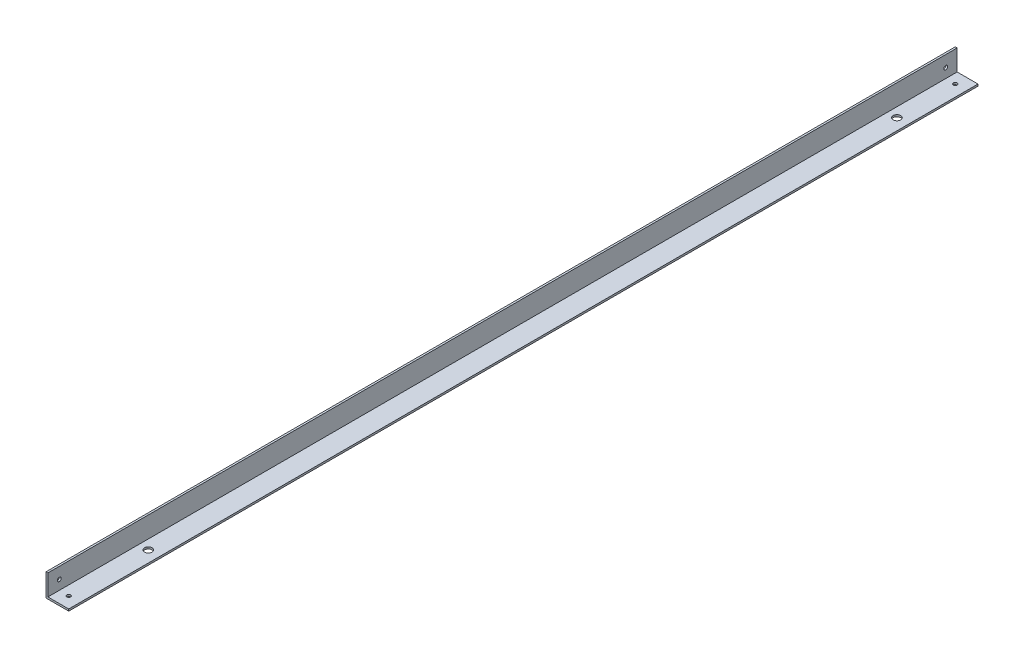
ISO-10303-21;
HEADER;
FILE_DESCRIPTION(('STEP AP214'),'2;1');
FILE_NAME('part.step','',(''),(''),'','','');
FILE_SCHEMA(('AUTOMOTIVE_DESIGN { 1 0 10303 214 1 1 1 1 }'));
ENDSEC;
DATA;
#1=APPLICATION_CONTEXT('core data for automotive mechanical design processes');
#2=APPLICATION_PROTOCOL_DEFINITION('international standard','automotive_design',2000,#1);
#3=PRODUCT_CONTEXT('',#1,'mechanical');
#4=PRODUCT('Part','Part','',(#3));
#5=PRODUCT_RELATED_PRODUCT_CATEGORY('part','',(#4));
#6=PRODUCT_DEFINITION_FORMATION('','',#4);
#7=PRODUCT_DEFINITION_CONTEXT('part definition',#1,'design');
#8=PRODUCT_DEFINITION('design','',#6,#7);
#9=PRODUCT_DEFINITION_SHAPE('','',#8);
#10=(LENGTH_UNIT() NAMED_UNIT(*) SI_UNIT(.MILLI.,.METRE.));
#11=(NAMED_UNIT(*) PLANE_ANGLE_UNIT() SI_UNIT($,.RADIAN.));
#12=(NAMED_UNIT(*) SI_UNIT($,.STERADIAN.) SOLID_ANGLE_UNIT());
#13=UNCERTAINTY_MEASURE_WITH_UNIT(LENGTH_MEASURE(1.E-05),#10,'distance_accuracy_value','');
#14=(GEOMETRIC_REPRESENTATION_CONTEXT(3) GLOBAL_UNCERTAINTY_ASSIGNED_CONTEXT((#13)) GLOBAL_UNIT_ASSIGNED_CONTEXT((#10,
#11,#12)) REPRESENTATION_CONTEXT('',''));
#15=CARTESIAN_POINT('',(0.,0.,0.));
#16=DIRECTION('',(0.,0.,1.));
#17=DIRECTION('',(1.,0.,0.));
#18=AXIS2_PLACEMENT_3D('',#15,#16,#17);
#19=CARTESIAN_POINT('',(0.,0.,-762.));
#20=DIRECTION('',(0.,-1.,0.));
#21=DIRECTION('',(0.,0.,-1.));
#22=AXIS2_PLACEMENT_3D('',#19,#20,#21);
#23=PLANE('',#22);
#24=CARTESIAN_POINT('',(9.525,0.,-752.475));
#25=DIRECTION('',(0.,-1.,0.));
#26=DIRECTION('',(0.,0.,-1.));
#27=AXIS2_PLACEMENT_3D('',#24,#25,#26);
#28=CIRCLE('',#27,1.58750000000003);
#29=CARTESIAN_POINT('',(9.525,0.,-754.0625));
#30=VERTEX_POINT('',#29);
#31=EDGE_CURVE('E149',#30,#30,#28,.T.);
#32=ORIENTED_EDGE('',*,*,#31,.F.);
#33=EDGE_LOOP('',(#32));
#34=FACE_BOUND('',#33,.T.);
#35=CARTESIAN_POINT('',(9.525,0.,-76.2));
#36=DIRECTION('',(0.,-1.,0.));
#37=DIRECTION('',(0.,0.,-1.));
#38=AXIS2_PLACEMENT_3D('',#35,#36,#37);
#39=CIRCLE('',#38,3.175);
#40=CARTESIAN_POINT('',(9.525,0.,-79.375));
#41=VERTEX_POINT('',#40);
#42=EDGE_CURVE('E146',#41,#41,#39,.T.);
#43=ORIENTED_EDGE('',*,*,#42,.F.);
#44=EDGE_LOOP('',(#43));
#45=FACE_BOUND('',#44,.T.);
#46=CARTESIAN_POINT('',(9.525,0.,-703.58));
#47=DIRECTION('',(0.,-1.,0.));
#48=DIRECTION('',(0.,0.,-1.));
#49=AXIS2_PLACEMENT_3D('',#46,#47,#48);
#50=CIRCLE('',#49,3.175);
#51=CARTESIAN_POINT('',(9.525,0.,-706.755));
#52=VERTEX_POINT('',#51);
#53=EDGE_CURVE('E118',#52,#52,#50,.T.);
#54=ORIENTED_EDGE('',*,*,#53,.F.);
#55=EDGE_LOOP('',(#54));
#56=FACE_BOUND('',#55,.T.);
#57=CARTESIAN_POINT('',(9.525,0.,-9.525));
#58=DIRECTION('',(0.,-1.,0.));
#59=DIRECTION('',(0.,0.,-1.));
#60=AXIS2_PLACEMENT_3D('',#57,#58,#59);
#61=CIRCLE('',#60,1.5875);
#62=CARTESIAN_POINT('',(9.525,0.,-11.1125));
#63=VERTEX_POINT('',#62);
#64=EDGE_CURVE('E113',#63,#63,#61,.T.);
#65=ORIENTED_EDGE('',*,*,#64,.F.);
#66=EDGE_LOOP('',(#65));
#67=FACE_BOUND('',#66,.T.);
#68=DIRECTION('',(1.,0.,0.));
#69=VECTOR('',#68,1.);
#70=CARTESIAN_POINT('',(0.,0.,-762.));
#71=LINE('',#70,#69);
#72=CARTESIAN_POINT('',(0.,0.,-762.));
#73=VERTEX_POINT('',#72);
#74=CARTESIAN_POINT('',(19.05,0.,-762.));
#75=VERTEX_POINT('',#74);
#76=EDGE_CURVE('E107',#73,#75,#71,.T.);
#77=ORIENTED_EDGE('',*,*,#76,.T.);
#78=DIRECTION('',(0.,0.,1.));
#79=VECTOR('',#78,1.);
#80=CARTESIAN_POINT('',(19.05,0.,-762.));
#81=LINE('',#80,#79);
#82=CARTESIAN_POINT('',(19.05,0.,0.));
#83=VERTEX_POINT('',#82);
#84=EDGE_CURVE('E98',#75,#83,#81,.T.);
#85=ORIENTED_EDGE('',*,*,#84,.T.);
#86=DIRECTION('',(1.,0.,0.));
#87=VECTOR('',#86,1.);
#88=CARTESIAN_POINT('',(0.,0.,0.));
#89=LINE('',#88,#87);
#90=CARTESIAN_POINT('',(0.,0.,0.));
#91=VERTEX_POINT('',#90);
#92=EDGE_CURVE('E105',#91,#83,#89,.T.);
#93=ORIENTED_EDGE('',*,*,#92,.F.);
#94=DIRECTION('',(0.,0.,1.));
#95=VECTOR('',#94,1.);
#96=CARTESIAN_POINT('',(0.,0.,-762.));
#97=LINE('',#96,#95);
#98=EDGE_CURVE('E12',#73,#91,#97,.T.);
#99=ORIENTED_EDGE('',*,*,#98,.F.);
#100=EDGE_LOOP('',(#77,#85,#93,#99));
#101=FACE_BOUND('',#100,.T.);
#102=ADVANCED_FACE('F37',(#34,#45,#56,#67,#101),#23,.T.);
#103=CARTESIAN_POINT('',(19.05,1.5875,-762.));
#104=DIRECTION('',(0.,1.,0.));
#105=DIRECTION('',(0.,0.,1.));
#106=AXIS2_PLACEMENT_3D('',#103,#104,#105);
#107=PLANE('',#106);
#108=CARTESIAN_POINT('',(9.525,1.5875,-752.475));
#109=DIRECTION('',(0.,1.,0.));
#110=DIRECTION('',(0.,0.,1.));
#111=AXIS2_PLACEMENT_3D('',#108,#109,#110);
#112=CIRCLE('',#111,1.58750000000003);
#113=CARTESIAN_POINT('',(9.525,1.5875,-750.8875));
#114=VERTEX_POINT('',#113);
#115=EDGE_CURVE('E156',#114,#114,#112,.T.);
#116=ORIENTED_EDGE('',*,*,#115,.F.);
#117=EDGE_LOOP('',(#116));
#118=FACE_BOUND('',#117,.T.);
#119=CARTESIAN_POINT('',(9.525,1.5875,-76.2));
#120=DIRECTION('',(0.,1.,0.));
#121=DIRECTION('',(0.,0.,1.));
#122=AXIS2_PLACEMENT_3D('',#119,#120,#121);
#123=CIRCLE('',#122,3.175);
#124=CARTESIAN_POINT('',(9.525,1.5875,-73.025));
#125=VERTEX_POINT('',#124);
#126=EDGE_CURVE('E153',#125,#125,#123,.T.);
#127=ORIENTED_EDGE('',*,*,#126,.F.);
#128=EDGE_LOOP('',(#127));
#129=FACE_BOUND('',#128,.T.);
#130=CARTESIAN_POINT('',(9.525,1.5875,-703.58));
#131=DIRECTION('',(0.,1.,0.));
#132=DIRECTION('',(0.,0.,1.));
#133=AXIS2_PLACEMENT_3D('',#130,#131,#132);
#134=CIRCLE('',#133,3.175);
#135=CARTESIAN_POINT('',(9.525,1.5875,-700.405));
#136=VERTEX_POINT('',#135);
#137=EDGE_CURVE('E157',#136,#136,#134,.T.);
#138=ORIENTED_EDGE('',*,*,#137,.F.);
#139=EDGE_LOOP('',(#138));
#140=FACE_BOUND('',#139,.T.);
#141=CARTESIAN_POINT('',(9.525,1.5875,-9.525));
#142=DIRECTION('',(0.,1.,0.));
#143=DIRECTION('',(0.,0.,1.));
#144=AXIS2_PLACEMENT_3D('',#141,#142,#143);
#145=CIRCLE('',#144,1.5875);
#146=CARTESIAN_POINT('',(9.525,1.5875,-7.9375));
#147=VERTEX_POINT('',#146);
#148=EDGE_CURVE('E152',#147,#147,#145,.T.);
#149=ORIENTED_EDGE('',*,*,#148,.F.);
#150=EDGE_LOOP('',(#149));
#151=FACE_BOUND('',#150,.T.);
#152=DIRECTION('',(-1.,0.,0.));
#153=VECTOR('',#152,1.);
#154=CARTESIAN_POINT('',(19.05,1.5875,0.));
#155=LINE('',#154,#153);
#156=CARTESIAN_POINT('',(19.05,1.5875,0.));
#157=VERTEX_POINT('',#156);
#158=CARTESIAN_POINT('',(1.5875,1.5875,0.));
#159=VERTEX_POINT('',#158);
#160=EDGE_CURVE('E112',#157,#159,#155,.T.);
#161=ORIENTED_EDGE('',*,*,#160,.F.);
#162=DIRECTION('',(0.,0.,-1.));
#163=VECTOR('',#162,1.);
#164=CARTESIAN_POINT('',(19.05,1.5875,-762.));
#165=LINE('',#164,#163);
#166=CARTESIAN_POINT('',(19.05,1.5875,-762.));
#167=VERTEX_POINT('',#166);
#168=EDGE_CURVE('E53',#157,#167,#165,.T.);
#169=ORIENTED_EDGE('',*,*,#168,.T.);
#170=DIRECTION('',(-1.,0.,0.));
#171=VECTOR('',#170,1.);
#172=CARTESIAN_POINT('',(19.05,1.5875,-762.));
#173=LINE('',#172,#171);
#174=CARTESIAN_POINT('',(1.5875,1.5875,-762.));
#175=VERTEX_POINT('',#174);
#176=EDGE_CURVE('E86',#167,#175,#173,.T.);
#177=ORIENTED_EDGE('',*,*,#176,.T.);
#178=DIRECTION('',(0.,0.,1.));
#179=VECTOR('',#178,1.);
#180=CARTESIAN_POINT('',(1.5875,1.5875,-762.));
#181=LINE('',#180,#179);
#182=EDGE_CURVE('E40',#175,#159,#181,.T.);
#183=ORIENTED_EDGE('',*,*,#182,.T.);
#184=EDGE_LOOP('',(#161,#169,#177,#183));
#185=FACE_BOUND('',#184,.T.);
#186=ADVANCED_FACE('F178',(#118,#129,#140,#151,#185),#107,.T.);
#187=CARTESIAN_POINT('',(0.,0.,-762.));
#188=DIRECTION('',(0.,0.,1.));
#189=DIRECTION('',(1.,0.,0.));
#190=AXIS2_PLACEMENT_3D('',#187,#188,#189);
#191=PLANE('',#190);
#192=DIRECTION('',(0.,1.,0.));
#193=VECTOR('',#192,1.);
#194=CARTESIAN_POINT('',(19.05,19.05,-762.));
#195=LINE('',#194,#193);
#196=EDGE_CURVE('E103',#75,#167,#195,.T.);
#197=ORIENTED_EDGE('',*,*,#196,.F.);
#198=ORIENTED_EDGE('',*,*,#76,.F.);
#199=DIRECTION('',(0.,-1.,0.));
#200=VECTOR('',#199,1.);
#201=CARTESIAN_POINT('',(0.,0.,-762.));
#202=LINE('',#201,#200);
#203=CARTESIAN_POINT('',(0.,19.05,-762.));
#204=VERTEX_POINT('',#203);
#205=EDGE_CURVE('E121',#204,#73,#202,.T.);
#206=ORIENTED_EDGE('',*,*,#205,.F.);
#207=DIRECTION('',(-1.,0.,0.));
#208=VECTOR('',#207,1.);
#209=CARTESIAN_POINT('',(0.,19.05,-762.));
#210=LINE('',#209,#208);
#211=CARTESIAN_POINT('',(1.5875,19.05,-762.));
#212=VERTEX_POINT('',#211);
#213=EDGE_CURVE('E134',#212,#204,#210,.T.);
#214=ORIENTED_EDGE('',*,*,#213,.F.);
#215=DIRECTION('',(0.,1.,0.));
#216=VECTOR('',#215,1.);
#217=CARTESIAN_POINT('',(1.5875,1.5875,-762.));
#218=LINE('',#217,#216);
#219=EDGE_CURVE('E137',#175,#212,#218,.T.);
#220=ORIENTED_EDGE('',*,*,#219,.F.);
#221=ORIENTED_EDGE('',*,*,#176,.F.);
#222=EDGE_LOOP('',(#197,#198,#206,#214,#220,#221));
#223=FACE_BOUND('',#222,.T.);
#224=ADVANCED_FACE('F180',(#223),#191,.F.);
#225=CARTESIAN_POINT('',(0.,0.,0.));
#226=DIRECTION('',(0.,0.,1.));
#227=DIRECTION('',(1.,0.,0.));
#228=AXIS2_PLACEMENT_3D('',#225,#226,#227);
#229=PLANE('',#228);
#230=ORIENTED_EDGE('',*,*,#92,.T.);
#231=DIRECTION('',(0.,1.,0.));
#232=VECTOR('',#231,1.);
#233=CARTESIAN_POINT('',(19.05,19.05,0.));
#234=LINE('',#233,#232);
#235=EDGE_CURVE('E95',#83,#157,#234,.T.);
#236=ORIENTED_EDGE('',*,*,#235,.T.);
#237=ORIENTED_EDGE('',*,*,#160,.T.);
#238=DIRECTION('',(0.,1.,0.));
#239=VECTOR('',#238,1.);
#240=CARTESIAN_POINT('',(1.5875,1.5875,0.));
#241=LINE('',#240,#239);
#242=CARTESIAN_POINT('',(1.5875,19.05,0.));
#243=VERTEX_POINT('',#242);
#244=EDGE_CURVE('E115',#159,#243,#241,.T.);
#245=ORIENTED_EDGE('',*,*,#244,.T.);
#246=DIRECTION('',(-1.,0.,0.));
#247=VECTOR('',#246,1.);
#248=CARTESIAN_POINT('',(0.,19.05,0.));
#249=LINE('',#248,#247);
#250=CARTESIAN_POINT('',(0.,19.05,0.));
#251=VERTEX_POINT('',#250);
#252=EDGE_CURVE('E126',#243,#251,#249,.T.);
#253=ORIENTED_EDGE('',*,*,#252,.T.);
#254=DIRECTION('',(0.,-1.,0.));
#255=VECTOR('',#254,1.);
#256=CARTESIAN_POINT('',(0.,0.,0.));
#257=LINE('',#256,#255);
#258=EDGE_CURVE('E111',#251,#91,#257,.T.);
#259=ORIENTED_EDGE('',*,*,#258,.T.);
#260=EDGE_LOOP('',(#230,#236,#237,#245,#253,#259));
#261=FACE_BOUND('',#260,.T.);
#262=ADVANCED_FACE('F109',(#261),#229,.T.);
#263=CARTESIAN_POINT('',(0.,0.,-762.));
#264=DIRECTION('',(-1.,0.,0.));
#265=DIRECTION('',(0.,0.,1.));
#266=AXIS2_PLACEMENT_3D('',#263,#264,#265);
#267=PLANE('',#266);
#268=CARTESIAN_POINT('',(0.,9.525,-752.475));
#269=DIRECTION('',(-1.,0.,0.));
#270=DIRECTION('',(0.,0.,1.));
#271=AXIS2_PLACEMENT_3D('',#268,#269,#270);
#272=CIRCLE('',#271,1.58749999999993);
#273=CARTESIAN_POINT('',(0.,9.525,-754.0625));
#274=VERTEX_POINT('',#273);
#275=EDGE_CURVE('E162',#274,#274,#272,.T.);
#276=ORIENTED_EDGE('',*,*,#275,.F.);
#277=EDGE_LOOP('',(#276));
#278=FACE_BOUND('',#277,.T.);
#279=CARTESIAN_POINT('',(0.,9.525,-9.525));
#280=DIRECTION('',(-1.,0.,0.));
#281=DIRECTION('',(0.,0.,1.));
#282=AXIS2_PLACEMENT_3D('',#279,#280,#281);
#283=CIRCLE('',#282,1.5875);
#284=CARTESIAN_POINT('',(0.,9.525,-11.1125));
#285=VERTEX_POINT('',#284);
#286=EDGE_CURVE('E167',#285,#285,#283,.T.);
#287=ORIENTED_EDGE('',*,*,#286,.F.);
#288=EDGE_LOOP('',(#287));
#289=FACE_BOUND('',#288,.T.);
#290=ORIENTED_EDGE('',*,*,#258,.F.);
#291=DIRECTION('',(0.,0.,1.));
#292=VECTOR('',#291,1.);
#293=CARTESIAN_POINT('',(0.,19.05,-762.));
#294=LINE('',#293,#292);
#295=EDGE_CURVE('E45',#204,#251,#294,.T.);
#296=ORIENTED_EDGE('',*,*,#295,.F.);
#297=ORIENTED_EDGE('',*,*,#205,.T.);
#298=ORIENTED_EDGE('',*,*,#98,.T.);
#299=EDGE_LOOP('',(#290,#296,#297,#298));
#300=FACE_BOUND('',#299,.T.);
#301=ADVANCED_FACE('F182',(#278,#289,#300),#267,.T.);
#302=CARTESIAN_POINT('',(0.,19.05,-762.));
#303=DIRECTION('',(0.,1.,0.));
#304=DIRECTION('',(0.,0.,1.));
#305=AXIS2_PLACEMENT_3D('',#302,#303,#304);
#306=PLANE('',#305);
#307=ORIENTED_EDGE('',*,*,#252,.F.);
#308=DIRECTION('',(0.,0.,1.));
#309=VECTOR('',#308,1.);
#310=CARTESIAN_POINT('',(1.5875,19.05,-762.));
#311=LINE('',#310,#309);
#312=EDGE_CURVE('E129',#212,#243,#311,.T.);
#313=ORIENTED_EDGE('',*,*,#312,.F.);
#314=ORIENTED_EDGE('',*,*,#213,.T.);
#315=ORIENTED_EDGE('',*,*,#295,.T.);
#316=EDGE_LOOP('',(#307,#313,#314,#315));
#317=FACE_BOUND('',#316,.T.);
#318=ADVANCED_FACE('F183',(#317),#306,.T.);
#319=CARTESIAN_POINT('',(1.5875,1.5875,-762.));
#320=DIRECTION('',(1.,0.,0.));
#321=DIRECTION('',(0.,0.,-1.));
#322=AXIS2_PLACEMENT_3D('',#319,#320,#321);
#323=PLANE('',#322);
#324=CARTESIAN_POINT('',(1.5875,9.525,-752.475));
#325=DIRECTION('',(1.,0.,0.));
#326=DIRECTION('',(0.,0.,-1.));
#327=AXIS2_PLACEMENT_3D('',#324,#325,#326);
#328=CIRCLE('',#327,1.58749999999993);
#329=CARTESIAN_POINT('',(1.5875,9.525,-754.0625));
#330=VERTEX_POINT('',#329);
#331=EDGE_CURVE('E170',#330,#330,#328,.T.);
#332=ORIENTED_EDGE('',*,*,#331,.F.);
#333=EDGE_LOOP('',(#332));
#334=FACE_BOUND('',#333,.T.);
#335=CARTESIAN_POINT('',(1.5875,9.525,-9.525));
#336=DIRECTION('',(1.,0.,0.));
#337=DIRECTION('',(0.,0.,-1.));
#338=AXIS2_PLACEMENT_3D('',#335,#336,#337);
#339=CIRCLE('',#338,1.5875);
#340=CARTESIAN_POINT('',(1.5875,9.525,-11.1125));
#341=VERTEX_POINT('',#340);
#342=EDGE_CURVE('E171',#341,#341,#339,.T.);
#343=ORIENTED_EDGE('',*,*,#342,.F.);
#344=EDGE_LOOP('',(#343));
#345=FACE_BOUND('',#344,.T.);
#346=ORIENTED_EDGE('',*,*,#244,.F.);
#347=ORIENTED_EDGE('',*,*,#182,.F.);
#348=ORIENTED_EDGE('',*,*,#219,.T.);
#349=ORIENTED_EDGE('',*,*,#312,.T.);
#350=EDGE_LOOP('',(#346,#347,#348,#349));
#351=FACE_BOUND('',#350,.T.);
#352=ADVANCED_FACE('F181',(#334,#345,#351),#323,.T.);
#353=CARTESIAN_POINT('',(9.525,-1.2065,-752.475));
#354=DIRECTION('',(0.,1.,0.));
#355=DIRECTION('',(0.,0.,1.));
#356=AXIS2_PLACEMENT_3D('',#353,#354,#355);
#357=CYLINDRICAL_SURFACE('',#356,1.58750000000003);
#358=ORIENTED_EDGE('',*,*,#31,.T.);
#359=EDGE_LOOP('',(#358));
#360=FACE_BOUND('',#359,.T.);
#361=ORIENTED_EDGE('',*,*,#115,.T.);
#362=EDGE_LOOP('',(#361));
#363=FACE_BOUND('',#362,.T.);
#364=ADVANCED_FACE('F190',(#360,#363),#357,.F.);
#365=CARTESIAN_POINT('',(9.525,-1.2065,-76.2));
#366=DIRECTION('',(0.,1.,0.));
#367=DIRECTION('',(0.,0.,1.));
#368=AXIS2_PLACEMENT_3D('',#365,#366,#367);
#369=CYLINDRICAL_SURFACE('',#368,3.175);
#370=ORIENTED_EDGE('',*,*,#42,.T.);
#371=EDGE_LOOP('',(#370));
#372=FACE_BOUND('',#371,.T.);
#373=ORIENTED_EDGE('',*,*,#126,.T.);
#374=EDGE_LOOP('',(#373));
#375=FACE_BOUND('',#374,.T.);
#376=ADVANCED_FACE('F224',(#372,#375),#369,.F.);
#377=CARTESIAN_POINT('',(9.525,-1.2065,-703.58));
#378=DIRECTION('',(0.,1.,0.));
#379=DIRECTION('',(0.,0.,1.));
#380=AXIS2_PLACEMENT_3D('',#377,#378,#379);
#381=CYLINDRICAL_SURFACE('',#380,3.175);
#382=ORIENTED_EDGE('',*,*,#53,.T.);
#383=EDGE_LOOP('',(#382));
#384=FACE_BOUND('',#383,.T.);
#385=ORIENTED_EDGE('',*,*,#137,.T.);
#386=EDGE_LOOP('',(#385));
#387=FACE_BOUND('',#386,.T.);
#388=ADVANCED_FACE('F213',(#384,#387),#381,.F.);
#389=CARTESIAN_POINT('',(9.525,-1.2065,-9.525));
#390=DIRECTION('',(0.,1.,0.));
#391=DIRECTION('',(0.,0.,1.));
#392=AXIS2_PLACEMENT_3D('',#389,#390,#391);
#393=CYLINDRICAL_SURFACE('',#392,1.5875);
#394=ORIENTED_EDGE('',*,*,#64,.T.);
#395=EDGE_LOOP('',(#394));
#396=FACE_BOUND('',#395,.T.);
#397=ORIENTED_EDGE('',*,*,#148,.T.);
#398=EDGE_LOOP('',(#397));
#399=FACE_BOUND('',#398,.T.);
#400=ADVANCED_FACE('F209',(#396,#399),#393,.F.);
#401=CARTESIAN_POINT('',(-7.3025,9.525,-9.525));
#402=DIRECTION('',(1.,0.,0.));
#403=DIRECTION('',(0.,0.,-1.));
#404=AXIS2_PLACEMENT_3D('',#401,#402,#403);
#405=CYLINDRICAL_SURFACE('',#404,1.5875);
#406=CARTESIAN_POINT('',(0.,9.525,-11.1125));
#407=CARTESIAN_POINT('',(0.0165364583333341,9.525,-11.1125));
#408=CARTESIAN_POINT('',(0.0330729166666674,9.525,-11.1125));
#409=CARTESIAN_POINT('',(0.0661458333333342,9.525,-11.1125));
#410=CARTESIAN_POINT('',(0.0826822916666677,9.525,-11.1125));
#411=CARTESIAN_POINT('',(0.115755208333334,9.525,-11.1125));
#412=CARTESIAN_POINT('',(0.132291666666668,9.525,-11.1125));
#413=CARTESIAN_POINT('',(0.165364583333334,9.525,-11.1125));
#414=CARTESIAN_POINT('',(0.181901041666667,9.525,-11.1125));
#415=CARTESIAN_POINT('',(0.214973958333334,9.525,-11.1125));
#416=CARTESIAN_POINT('',(0.231510416666668,9.525,-11.1125));
#417=CARTESIAN_POINT('',(0.264583333333335,9.525,-11.1125));
#418=CARTESIAN_POINT('',(0.281119791666668,9.525,-11.1125));
#419=CARTESIAN_POINT('',(0.314192708333334,9.525,-11.1125));
#420=CARTESIAN_POINT('',(0.330729166666668,9.525,-11.1125));
#421=CARTESIAN_POINT('',(0.363802083333334,9.525,-11.1125));
#422=CARTESIAN_POINT('',(0.380338541666667,9.525,-11.1125));
#423=CARTESIAN_POINT('',(0.413411458333334,9.525,-11.1125));
#424=CARTESIAN_POINT('',(0.429947916666668,9.525,-11.1125));
#425=CARTESIAN_POINT('',(0.463020833333334,9.525,-11.1125));
#426=CARTESIAN_POINT('',(0.479557291666668,9.525,-11.1125));
#427=CARTESIAN_POINT('',(0.512630208333334,9.525,-11.1125));
#428=CARTESIAN_POINT('',(0.529166666666667,9.525,-11.1125));
#429=CARTESIAN_POINT('',(0.562239583333333,9.525,-11.1125));
#430=CARTESIAN_POINT('',(0.578776041666667,9.525,-11.1125));
#431=CARTESIAN_POINT('',(0.611848958333334,9.525,-11.1125));
#432=CARTESIAN_POINT('',(0.628385416666667,9.525,-11.1125));
#433=CARTESIAN_POINT('',(0.661458333333334,9.525,-11.1125));
#434=CARTESIAN_POINT('',(0.677994791666667,9.525,-11.1125));
#435=CARTESIAN_POINT('',(0.711067708333333,9.525,-11.1125));
#436=CARTESIAN_POINT('',(0.727604166666667,9.525,-11.1125));
#437=CARTESIAN_POINT('',(0.760677083333334,9.525,-11.1125));
#438=CARTESIAN_POINT('',(0.777213541666667,9.525,-11.1125));
#439=CARTESIAN_POINT('',(0.810286458333334,9.525,-11.1125));
#440=CARTESIAN_POINT('',(0.826822916666667,9.525,-11.1125));
#441=CARTESIAN_POINT('',(0.859895833333334,9.525,-11.1125));
#442=CARTESIAN_POINT('',(0.876432291666667,9.525,-11.1125));
#443=CARTESIAN_POINT('',(0.909505208333334,9.525,-11.1125));
#444=CARTESIAN_POINT('',(0.926041666666668,9.525,-11.1125));
#445=CARTESIAN_POINT('',(0.959114583333334,9.525,-11.1125));
#446=CARTESIAN_POINT('',(0.975651041666667,9.525,-11.1125));
#447=CARTESIAN_POINT('',(1.00872395833333,9.525,-11.1125));
#448=CARTESIAN_POINT('',(1.02526041666667,9.525,-11.1125));
#449=CARTESIAN_POINT('',(1.05833333333333,9.525,-11.1125));
#450=CARTESIAN_POINT('',(1.07486979166667,9.525,-11.1125));
#451=CARTESIAN_POINT('',(1.10794270833333,9.525,-11.1125));
#452=CARTESIAN_POINT('',(1.12447916666667,9.525,-11.1125));
#453=CARTESIAN_POINT('',(1.15755208333333,9.525,-11.1125));
#454=CARTESIAN_POINT('',(1.17408854166667,9.525,-11.1125));
#455=CARTESIAN_POINT('',(1.20716145833333,9.525,-11.1125));
#456=CARTESIAN_POINT('',(1.22369791666667,9.525,-11.1125));
#457=CARTESIAN_POINT('',(1.25677083333333,9.525,-11.1125));
#458=CARTESIAN_POINT('',(1.27330729166667,9.525,-11.1125));
#459=CARTESIAN_POINT('',(1.30638020833333,9.525,-11.1125));
#460=CARTESIAN_POINT('',(1.32291666666667,9.525,-11.1125));
#461=CARTESIAN_POINT('',(1.35598958333333,9.525,-11.1125));
#462=CARTESIAN_POINT('',(1.37252604166667,9.525,-11.1125));
#463=CARTESIAN_POINT('',(1.40559895833333,9.525,-11.1125));
#464=CARTESIAN_POINT('',(1.42213541666667,9.525,-11.1125));
#465=CARTESIAN_POINT('',(1.45520833333333,9.525,-11.1125));
#466=CARTESIAN_POINT('',(1.47174479166667,9.525,-11.1125));
#467=CARTESIAN_POINT('',(1.50481770833333,9.525,-11.1125));
#468=CARTESIAN_POINT('',(1.52135416666667,9.525,-11.1125));
#469=CARTESIAN_POINT('',(1.55442708333333,9.525,-11.1125));
#470=CARTESIAN_POINT('',(1.57096354166667,9.525,-11.1125));
#471=CARTESIAN_POINT('',(1.5875,9.525,-11.1125));
#472=B_SPLINE_CURVE_WITH_KNOTS('',3,(#406,#407,#408,#409,#410,#411,#412,#413,#414,#415,#416,
#417,#418,#419,#420,#421,#422,#423,#424,#425,#426,#427,#428,#429,#430,#431,#432,#433,#434,#435,
#436,#437,#438,#439,#440,#441,#442,#443,#444,#445,#446,#447,#448,#449,#450,#451,#452,#453,#454,
#455,#456,#457,#458,#459,#460,#461,#462,#463,#464,#465,#466,#467,#468,#469,#470,#471),
.UNSPECIFIED.,.F.,.F.,(4,2,2,2,2,2,2,2,2,2,2,2,2,2,2,2,2,2,2,2,2,2,2,2,2,2,2,2,2,2,2,2,4),(0.,
0.0496093749999997,0.0992187500000004,0.148828125,0.1984375,0.248046875,0.29765625,0.347265625,
0.396875,0.446484375,0.49609375,0.545703124999999,0.595312499999999,0.644921875,
0.694531249999999,0.744140625,0.79375,0.843359374999999,0.89296875,0.942578125,
0.992187499999999,1.041796875,1.09140625,1.141015625,1.190625,1.240234375,1.28984375,
1.339453125,1.3890625,1.438671875,1.48828125,1.537890625,1.5875),.UNSPECIFIED.);
#473=EDGE_CURVE('BSEAM212',#285,#341,#472,.T.);
#474=ORIENTED_EDGE('',*,*,#286,.T.);
#475=ORIENTED_EDGE('',*,*,#342,.T.);
#476=ORIENTED_EDGE('',*,*,#473,.T.);
#477=ORIENTED_EDGE('',*,*,#473,.F.);
#478=EDGE_LOOP('',(#474,#476,#475,#477));
#479=FACE_BOUND('',#478,.T.);
#480=ADVANCED_FACE('F212',(#479),#405,.F.);
#481=CARTESIAN_POINT('',(-7.3025,9.525,-752.475));
#482=DIRECTION('',(1.,0.,0.));
#483=DIRECTION('',(0.,0.,-1.));
#484=AXIS2_PLACEMENT_3D('',#481,#482,#483);
#485=CYLINDRICAL_SURFACE('',#484,1.58749999999993);
#486=CARTESIAN_POINT('',(0.,9.525,-754.0625));
#487=CARTESIAN_POINT('',(0.0165364583333341,9.525,-754.0625));
#488=CARTESIAN_POINT('',(0.0330729166666674,9.525,-754.0625));
#489=CARTESIAN_POINT('',(0.0661458333333342,9.525,-754.0625));
#490=CARTESIAN_POINT('',(0.0826822916666677,9.525,-754.0625));
#491=CARTESIAN_POINT('',(0.115755208333334,9.525,-754.0625));
#492=CARTESIAN_POINT('',(0.132291666666668,9.525,-754.0625));
#493=CARTESIAN_POINT('',(0.165364583333334,9.525,-754.0625));
#494=CARTESIAN_POINT('',(0.181901041666667,9.525,-754.0625));
#495=CARTESIAN_POINT('',(0.214973958333334,9.525,-754.0625));
#496=CARTESIAN_POINT('',(0.231510416666668,9.525,-754.0625));
#497=CARTESIAN_POINT('',(0.264583333333335,9.525,-754.0625));
#498=CARTESIAN_POINT('',(0.281119791666668,9.525,-754.0625));
#499=CARTESIAN_POINT('',(0.314192708333334,9.525,-754.0625));
#500=CARTESIAN_POINT('',(0.330729166666668,9.525,-754.0625));
#501=CARTESIAN_POINT('',(0.363802083333334,9.525,-754.0625));
#502=CARTESIAN_POINT('',(0.380338541666667,9.525,-754.0625));
#503=CARTESIAN_POINT('',(0.413411458333334,9.525,-754.0625));
#504=CARTESIAN_POINT('',(0.429947916666668,9.525,-754.0625));
#505=CARTESIAN_POINT('',(0.463020833333334,9.525,-754.0625));
#506=CARTESIAN_POINT('',(0.479557291666668,9.525,-754.0625));
#507=CARTESIAN_POINT('',(0.512630208333334,9.525,-754.0625));
#508=CARTESIAN_POINT('',(0.529166666666667,9.525,-754.0625));
#509=CARTESIAN_POINT('',(0.562239583333333,9.525,-754.0625));
#510=CARTESIAN_POINT('',(0.578776041666667,9.525,-754.0625));
#511=CARTESIAN_POINT('',(0.611848958333334,9.525,-754.0625));
#512=CARTESIAN_POINT('',(0.628385416666667,9.525,-754.0625));
#513=CARTESIAN_POINT('',(0.661458333333334,9.525,-754.0625));
#514=CARTESIAN_POINT('',(0.677994791666667,9.525,-754.0625));
#515=CARTESIAN_POINT('',(0.711067708333333,9.525,-754.0625));
#516=CARTESIAN_POINT('',(0.727604166666667,9.525,-754.0625));
#517=CARTESIAN_POINT('',(0.760677083333334,9.525,-754.0625));
#518=CARTESIAN_POINT('',(0.777213541666667,9.525,-754.0625));
#519=CARTESIAN_POINT('',(0.810286458333334,9.525,-754.0625));
#520=CARTESIAN_POINT('',(0.826822916666667,9.525,-754.0625));
#521=CARTESIAN_POINT('',(0.859895833333334,9.525,-754.0625));
#522=CARTESIAN_POINT('',(0.876432291666667,9.525,-754.0625));
#523=CARTESIAN_POINT('',(0.909505208333334,9.525,-754.0625));
#524=CARTESIAN_POINT('',(0.926041666666668,9.525,-754.0625));
#525=CARTESIAN_POINT('',(0.959114583333334,9.525,-754.0625));
#526=CARTESIAN_POINT('',(0.975651041666667,9.525,-754.0625));
#527=CARTESIAN_POINT('',(1.00872395833333,9.525,-754.0625));
#528=CARTESIAN_POINT('',(1.02526041666667,9.525,-754.0625));
#529=CARTESIAN_POINT('',(1.05833333333333,9.525,-754.0625));
#530=CARTESIAN_POINT('',(1.07486979166667,9.525,-754.0625));
#531=CARTESIAN_POINT('',(1.10794270833333,9.525,-754.0625));
#532=CARTESIAN_POINT('',(1.12447916666667,9.525,-754.0625));
#533=CARTESIAN_POINT('',(1.15755208333333,9.525,-754.0625));
#534=CARTESIAN_POINT('',(1.17408854166667,9.525,-754.0625));
#535=CARTESIAN_POINT('',(1.20716145833333,9.525,-754.0625));
#536=CARTESIAN_POINT('',(1.22369791666667,9.525,-754.0625));
#537=CARTESIAN_POINT('',(1.25677083333333,9.525,-754.0625));
#538=CARTESIAN_POINT('',(1.27330729166667,9.525,-754.0625));
#539=CARTESIAN_POINT('',(1.30638020833333,9.525,-754.0625));
#540=CARTESIAN_POINT('',(1.32291666666667,9.525,-754.0625));
#541=CARTESIAN_POINT('',(1.35598958333333,9.525,-754.0625));
#542=CARTESIAN_POINT('',(1.37252604166667,9.525,-754.0625));
#543=CARTESIAN_POINT('',(1.40559895833333,9.525,-754.0625));
#544=CARTESIAN_POINT('',(1.42213541666667,9.525,-754.0625));
#545=CARTESIAN_POINT('',(1.45520833333333,9.525,-754.0625));
#546=CARTESIAN_POINT('',(1.47174479166667,9.525,-754.0625));
#547=CARTESIAN_POINT('',(1.50481770833333,9.525,-754.0625));
#548=CARTESIAN_POINT('',(1.52135416666667,9.525,-754.0625));
#549=CARTESIAN_POINT('',(1.55442708333333,9.525,-754.0625));
#550=CARTESIAN_POINT('',(1.57096354166667,9.525,-754.0625));
#551=CARTESIAN_POINT('',(1.5875,9.525,-754.0625));
#552=B_SPLINE_CURVE_WITH_KNOTS('',3,(#486,#487,#488,#489,#490,#491,#492,#493,#494,#495,#496,
#497,#498,#499,#500,#501,#502,#503,#504,#505,#506,#507,#508,#509,#510,#511,#512,#513,#514,#515,
#516,#517,#518,#519,#520,#521,#522,#523,#524,#525,#526,#527,#528,#529,#530,#531,#532,#533,#534,
#535,#536,#537,#538,#539,#540,#541,#542,#543,#544,#545,#546,#547,#548,#549,#550,#551),
.UNSPECIFIED.,.F.,.F.,(4,2,2,2,2,2,2,2,2,2,2,2,2,2,2,2,2,2,2,2,2,2,2,2,2,2,2,2,2,2,2,2,4),(0.,
0.0496093749999997,0.0992187500000004,0.148828125,0.1984375,0.248046875,0.29765625,0.347265625,
0.396875,0.446484375,0.49609375,0.545703124999999,0.595312499999999,0.644921875,
0.694531249999999,0.744140625,0.79375,0.843359374999999,0.89296875,0.942578125,
0.992187499999999,1.041796875,1.09140625,1.141015625,1.190625,1.240234375,1.28984375,
1.339453125,1.3890625,1.438671875,1.48828125,1.537890625,1.5875),.UNSPECIFIED.);
#553=EDGE_CURVE('BSEAM221',#274,#330,#552,.T.);
#554=ORIENTED_EDGE('',*,*,#275,.T.);
#555=ORIENTED_EDGE('',*,*,#331,.T.);
#556=ORIENTED_EDGE('',*,*,#553,.T.);
#557=ORIENTED_EDGE('',*,*,#553,.F.);
#558=EDGE_LOOP('',(#554,#556,#555,#557));
#559=FACE_BOUND('',#558,.T.);
#560=ADVANCED_FACE('F221',(#559),#485,.F.);
#561=CARTESIAN_POINT('',(19.05,19.05,-762.));
#562=DIRECTION('',(1.,0.,0.));
#563=DIRECTION('',(0.,1.,0.));
#564=AXIS2_PLACEMENT_3D('',#561,#562,#563);
#565=PLANE('',#564);
#566=ORIENTED_EDGE('',*,*,#235,.F.);
#567=ORIENTED_EDGE('',*,*,#84,.F.);
#568=ORIENTED_EDGE('',*,*,#196,.T.);
#569=ORIENTED_EDGE('',*,*,#168,.F.);
#570=EDGE_LOOP('',(#566,#567,#568,#569));
#571=FACE_BOUND('',#570,.T.);
#572=ADVANCED_FACE('F97',(#571),#565,.T.);
#573=CLOSED_SHELL('',(#102,#186,#224,#262,#301,#318,#352,#364,#376,#388,#400,#480,#560,#572));
#574=MANIFOLD_SOLID_BREP('B2',#573);
#575=ADVANCED_BREP_SHAPE_REPRESENTATION('',(#18,#574),#14);
#576=SHAPE_DEFINITION_REPRESENTATION(#9,#575);
ENDSEC;
END-ISO-10303-21;
